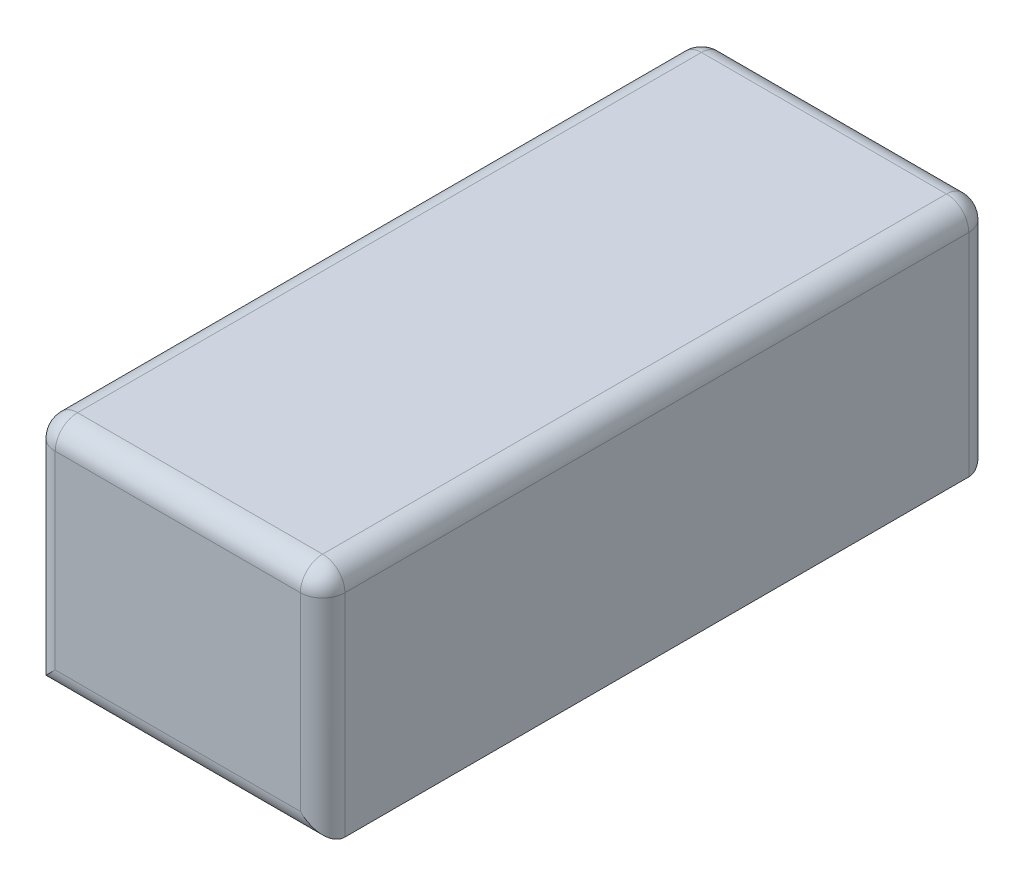
ISO-10303-21;
HEADER;
FILE_DESCRIPTION(('STEP AP214'),'2;1');
FILE_NAME('part.step','',(''),(''),'','','');
FILE_SCHEMA(('AUTOMOTIVE_DESIGN { 1 0 10303 214 1 1 1 1 }'));
ENDSEC;
DATA;
#1=APPLICATION_CONTEXT('core data for automotive mechanical design processes');
#2=APPLICATION_PROTOCOL_DEFINITION('international standard','automotive_design',2000,#1);
#3=PRODUCT_CONTEXT('',#1,'mechanical');
#4=PRODUCT('Part','Part','',(#3));
#5=PRODUCT_RELATED_PRODUCT_CATEGORY('part','',(#4));
#6=PRODUCT_DEFINITION_FORMATION('','',#4);
#7=PRODUCT_DEFINITION_CONTEXT('part definition',#1,'design');
#8=PRODUCT_DEFINITION('design','',#6,#7);
#9=PRODUCT_DEFINITION_SHAPE('','',#8);
#10=(LENGTH_UNIT() NAMED_UNIT(*) SI_UNIT(.MILLI.,.METRE.));
#11=(NAMED_UNIT(*) PLANE_ANGLE_UNIT() SI_UNIT($,.RADIAN.));
#12=(NAMED_UNIT(*) SI_UNIT($,.STERADIAN.) SOLID_ANGLE_UNIT());
#13=UNCERTAINTY_MEASURE_WITH_UNIT(LENGTH_MEASURE(1.E-05),#10,'distance_accuracy_value','');
#14=(GEOMETRIC_REPRESENTATION_CONTEXT(3) GLOBAL_UNCERTAINTY_ASSIGNED_CONTEXT((#13)) GLOBAL_UNIT_ASSIGNED_CONTEXT((#10,
#11,#12)) REPRESENTATION_CONTEXT('',''));
#15=CARTESIAN_POINT('',(0.,0.,0.));
#16=DIRECTION('',(0.,0.,1.));
#17=DIRECTION('',(1.,0.,0.));
#18=AXIS2_PLACEMENT_3D('',#15,#16,#17);
#19=CARTESIAN_POINT('',(13.,10.5,60.));
#20=DIRECTION('',(-1.,0.,0.));
#21=DIRECTION('',(0.,-1.,0.));
#22=AXIS2_PLACEMENT_3D('',#19,#20,#21);
#23=PLANE('',#22);
#24=DIRECTION('',(0.,0.,-1.));
#25=VECTOR('',#24,1.);
#26=CARTESIAN_POINT('',(13.,-10.5,60.));
#27=LINE('',#26,#25);
#28=CARTESIAN_POINT('',(13.,-10.5,58.));
#29=VERTEX_POINT('',#28);
#30=CARTESIAN_POINT('',(13.,-10.5,2.));
#31=VERTEX_POINT('',#30);
#32=EDGE_CURVE('E123',#29,#31,#27,.T.);
#33=ORIENTED_EDGE('',*,*,#32,.T.);
#34=DIRECTION('',(0.,1.,0.));
#35=VECTOR('',#34,1.);
#36=CARTESIAN_POINT('',(13.,10.5,2.));
#37=LINE('',#36,#35);
#38=CARTESIAN_POINT('',(13.,8.5,2.));
#39=VERTEX_POINT('',#38);
#40=EDGE_CURVE('E172',#31,#39,#37,.T.);
#41=ORIENTED_EDGE('',*,*,#40,.T.);
#42=DIRECTION('',(0.,0.,-1.));
#43=VECTOR('',#42,1.);
#44=CARTESIAN_POINT('',(13.,8.5,60.));
#45=LINE('',#44,#43);
#46=CARTESIAN_POINT('',(13.,8.5,58.));
#47=VERTEX_POINT('',#46);
#48=EDGE_CURVE('E168',#39,#47,#45,.F.);
#49=ORIENTED_EDGE('',*,*,#48,.T.);
#50=DIRECTION('',(0.,1.,0.));
#51=VECTOR('',#50,1.);
#52=CARTESIAN_POINT('',(13.,-10.5,58.));
#53=LINE('',#52,#51);
#54=EDGE_CURVE('E170',#47,#29,#53,.F.);
#55=ORIENTED_EDGE('',*,*,#54,.T.);
#56=EDGE_LOOP('',(#33,#41,#49,#55));
#57=FACE_BOUND('',#56,.T.);
#58=ADVANCED_FACE('F41',(#57),#23,.F.);
#59=CARTESIAN_POINT('',(-13.,10.5,60.));
#60=DIRECTION('',(0.,-1.,0.));
#61=DIRECTION('',(0.,0.,-1.));
#62=AXIS2_PLACEMENT_3D('',#59,#60,#61);
#63=PLANE('',#62);
#64=DIRECTION('',(-1.,0.,0.));
#65=VECTOR('',#64,1.);
#66=CARTESIAN_POINT('',(13.,10.5,58.));
#67=LINE('',#66,#65);
#68=CARTESIAN_POINT('',(-11.,10.5,58.));
#69=VERTEX_POINT('',#68);
#70=CARTESIAN_POINT('',(11.,10.5,58.));
#71=VERTEX_POINT('',#70);
#72=EDGE_CURVE('E50',#69,#71,#67,.F.);
#73=ORIENTED_EDGE('',*,*,#72,.T.);
#74=DIRECTION('',(0.,0.,-1.));
#75=VECTOR('',#74,1.);
#76=CARTESIAN_POINT('',(11.,10.5,60.));
#77=LINE('',#76,#75);
#78=CARTESIAN_POINT('',(11.,10.5,2.));
#79=VERTEX_POINT('',#78);
#80=EDGE_CURVE('E11',#71,#79,#77,.T.);
#81=ORIENTED_EDGE('',*,*,#80,.T.);
#82=DIRECTION('',(-1.,0.,0.));
#83=VECTOR('',#82,1.);
#84=CARTESIAN_POINT('',(-13.,10.5,2.));
#85=LINE('',#84,#83);
#86=CARTESIAN_POINT('',(-11.,10.5,2.));
#87=VERTEX_POINT('',#86);
#88=EDGE_CURVE('E181',#79,#87,#85,.T.);
#89=ORIENTED_EDGE('',*,*,#88,.T.);
#90=DIRECTION('',(0.,0.,-1.));
#91=VECTOR('',#90,1.);
#92=CARTESIAN_POINT('',(-11.,10.5,60.));
#93=LINE('',#92,#91);
#94=EDGE_CURVE('E61',#87,#69,#93,.F.);
#95=ORIENTED_EDGE('',*,*,#94,.T.);
#96=EDGE_LOOP('',(#73,#81,#89,#95));
#97=FACE_BOUND('',#96,.T.);
#98=ADVANCED_FACE('F258',(#97),#63,.F.);
#99=CARTESIAN_POINT('',(-13.,10.5,60.));
#100=DIRECTION('',(1.,0.,0.));
#101=DIRECTION('',(0.,1.,0.));
#102=AXIS2_PLACEMENT_3D('',#99,#100,#101);
#103=PLANE('',#102);
#104=DIRECTION('',(0.,0.,-1.));
#105=VECTOR('',#104,1.);
#106=CARTESIAN_POINT('',(-13.,8.5,60.));
#107=LINE('',#106,#105);
#108=CARTESIAN_POINT('',(-13.,8.5,58.));
#109=VERTEX_POINT('',#108);
#110=CARTESIAN_POINT('',(-13.,8.5,2.));
#111=VERTEX_POINT('',#110);
#112=EDGE_CURVE('E138',#109,#111,#107,.T.);
#113=ORIENTED_EDGE('',*,*,#112,.T.);
#114=DIRECTION('',(0.,-1.,0.));
#115=VECTOR('',#114,1.);
#116=CARTESIAN_POINT('',(-13.,10.5,2.));
#117=LINE('',#116,#115);
#118=CARTESIAN_POINT('',(-13.,-10.5,2.));
#119=VERTEX_POINT('',#118);
#120=EDGE_CURVE('E137',#111,#119,#117,.T.);
#121=ORIENTED_EDGE('',*,*,#120,.T.);
#122=DIRECTION('',(0.,0.,-1.));
#123=VECTOR('',#122,1.);
#124=CARTESIAN_POINT('',(-13.,-10.5,60.));
#125=LINE('',#124,#123);
#126=CARTESIAN_POINT('',(-13.,-10.5,58.));
#127=VERTEX_POINT('',#126);
#128=EDGE_CURVE('E121',#127,#119,#125,.T.);
#129=ORIENTED_EDGE('',*,*,#128,.F.);
#130=DIRECTION('',(0.,-1.,0.));
#131=VECTOR('',#130,1.);
#132=CARTESIAN_POINT('',(-13.,10.5,58.));
#133=LINE('',#132,#131);
#134=EDGE_CURVE('E134',#127,#109,#133,.F.);
#135=ORIENTED_EDGE('',*,*,#134,.T.);
#136=EDGE_LOOP('',(#113,#121,#129,#135));
#137=FACE_BOUND('',#136,.T.);
#138=ADVANCED_FACE('F132',(#137),#103,.F.);
#139=CARTESIAN_POINT('',(-13.,-10.5,60.));
#140=DIRECTION('',(0.,1.,0.));
#141=DIRECTION('',(0.,0.,1.));
#142=AXIS2_PLACEMENT_3D('',#139,#140,#141);
#143=PLANE('',#142);
#144=ORIENTED_EDGE('',*,*,#128,.T.);
#145=DIRECTION('',(1.,0.,0.));
#146=VECTOR('',#145,1.);
#147=CARTESIAN_POINT('',(-13.,-10.5,2.));
#148=LINE('',#147,#146);
#149=EDGE_CURVE('E127',#119,#31,#148,.T.);
#150=ORIENTED_EDGE('',*,*,#149,.T.);
#151=ORIENTED_EDGE('',*,*,#32,.F.);
#152=DIRECTION('',(1.,0.,0.));
#153=VECTOR('',#152,1.);
#154=CARTESIAN_POINT('',(-13.,-10.5,58.));
#155=LINE('',#154,#153);
#156=EDGE_CURVE('E118',#29,#127,#155,.F.);
#157=ORIENTED_EDGE('',*,*,#156,.T.);
#158=EDGE_LOOP('',(#144,#150,#151,#157));
#159=FACE_BOUND('',#158,.T.);
#160=ADVANCED_FACE('F120',(#159),#143,.F.);
#161=CARTESIAN_POINT('',(0.,0.,60.));
#162=DIRECTION('',(0.,0.,1.));
#163=DIRECTION('',(1.,0.,0.));
#164=AXIS2_PLACEMENT_3D('',#161,#162,#163);
#165=PLANE('',#164);
#166=DIRECTION('',(0.,-1.,0.));
#167=VECTOR('',#166,1.);
#168=CARTESIAN_POINT('',(-11.,-10.5,60.));
#169=LINE('',#168,#167);
#170=CARTESIAN_POINT('',(-11.,8.5,60.));
#171=VERTEX_POINT('',#170);
#172=CARTESIAN_POINT('',(-11.,-8.5,60.));
#173=VERTEX_POINT('',#172);
#174=EDGE_CURVE('E178',#171,#173,#169,.T.);
#175=ORIENTED_EDGE('',*,*,#174,.T.);
#176=DIRECTION('',(1.,0.,0.));
#177=VECTOR('',#176,1.);
#178=CARTESIAN_POINT('',(13.,-8.5,60.));
#179=LINE('',#178,#177);
#180=CARTESIAN_POINT('',(11.,-8.5,60.));
#181=VERTEX_POINT('',#180);
#182=EDGE_CURVE('E145',#173,#181,#179,.T.);
#183=ORIENTED_EDGE('',*,*,#182,.T.);
#184=DIRECTION('',(0.,1.,0.));
#185=VECTOR('',#184,1.);
#186=CARTESIAN_POINT('',(11.,10.5,60.));
#187=LINE('',#186,#185);
#188=CARTESIAN_POINT('',(11.,8.5,60.));
#189=VERTEX_POINT('',#188);
#190=EDGE_CURVE('E176',#181,#189,#187,.T.);
#191=ORIENTED_EDGE('',*,*,#190,.T.);
#192=DIRECTION('',(-1.,0.,0.));
#193=VECTOR('',#192,1.);
#194=CARTESIAN_POINT('',(-13.,8.5,60.));
#195=LINE('',#194,#193);
#196=EDGE_CURVE('E174',#189,#171,#195,.T.);
#197=ORIENTED_EDGE('',*,*,#196,.T.);
#198=EDGE_LOOP('',(#175,#183,#191,#197));
#199=FACE_BOUND('',#198,.T.);
#200=ADVANCED_FACE('F390',(#199),#165,.T.);
#201=CARTESIAN_POINT('',(0.,0.,0.));
#202=DIRECTION('',(0.,0.,1.));
#203=DIRECTION('',(1.,0.,0.));
#204=AXIS2_PLACEMENT_3D('',#201,#202,#203);
#205=PLANE('',#204);
#206=DIRECTION('',(1.,0.,0.));
#207=VECTOR('',#206,1.);
#208=CARTESIAN_POINT('',(0.,-8.5,0.));
#209=LINE('',#208,#207);
#210=CARTESIAN_POINT('',(11.,-8.5,0.));
#211=VERTEX_POINT('',#210);
#212=CARTESIAN_POINT('',(-11.,-8.5,0.));
#213=VERTEX_POINT('',#212);
#214=EDGE_CURVE('E163',#211,#213,#209,.F.);
#215=ORIENTED_EDGE('',*,*,#214,.T.);
#216=DIRECTION('',(0.,-1.,0.));
#217=VECTOR('',#216,1.);
#218=CARTESIAN_POINT('',(-11.,0.,0.));
#219=LINE('',#218,#217);
#220=CARTESIAN_POINT('',(-11.,8.5,0.));
#221=VERTEX_POINT('',#220);
#222=EDGE_CURVE('E128',#213,#221,#219,.F.);
#223=ORIENTED_EDGE('',*,*,#222,.T.);
#224=DIRECTION('',(-1.,0.,0.));
#225=VECTOR('',#224,1.);
#226=CARTESIAN_POINT('',(0.,8.5,0.));
#227=LINE('',#226,#225);
#228=CARTESIAN_POINT('',(11.,8.5,0.));
#229=VERTEX_POINT('',#228);
#230=EDGE_CURVE('E156',#221,#229,#227,.F.);
#231=ORIENTED_EDGE('',*,*,#230,.T.);
#232=DIRECTION('',(0.,1.,0.));
#233=VECTOR('',#232,1.);
#234=CARTESIAN_POINT('',(11.,0.,0.));
#235=LINE('',#234,#233);
#236=EDGE_CURVE('E161',#229,#211,#235,.F.);
#237=ORIENTED_EDGE('',*,*,#236,.T.);
#238=EDGE_LOOP('',(#215,#223,#231,#237));
#239=FACE_BOUND('',#238,.T.);
#240=ADVANCED_FACE('F240',(#239),#205,.F.);
#241=CARTESIAN_POINT('',(11.,0.,58.));
#242=DIRECTION('',(0.,-1.,0.));
#243=DIRECTION('',(1.,0.,0.));
#244=AXIS2_PLACEMENT_3D('',#241,#242,#243);
#245=CYLINDRICAL_SURFACE('',#244,2.);
#246=CARTESIAN_POINT('',(11.,8.5,58.));
#247=DIRECTION('',(0.,1.,0.));
#248=DIRECTION('',(0.,0.,1.));
#249=AXIS2_PLACEMENT_3D('',#246,#247,#248);
#250=CIRCLE('',#249,2.);
#251=EDGE_CURVE('E216',#189,#47,#250,.T.);
#252=ORIENTED_EDGE('',*,*,#251,.F.);
#253=ORIENTED_EDGE('',*,*,#190,.F.);
#254=CARTESIAN_POINT('',(11.,-8.5,58.));
#255=DIRECTION('',(-0.707106781186547,-0.707106781186548,0.));
#256=DIRECTION('',(0.707106781186548,-0.707106781186547,0.));
#257=AXIS2_PLACEMENT_3D('',#254,#255,#256);
#258=ELLIPSE('',#257,2.82842712474619,2.);
#259=EDGE_CURVE('E45',#29,#181,#258,.T.);
#260=ORIENTED_EDGE('',*,*,#259,.F.);
#261=ORIENTED_EDGE('',*,*,#54,.F.);
#262=EDGE_LOOP('',(#252,#253,#260,#261));
#263=FACE_BOUND('',#262,.T.);
#264=ADVANCED_FACE('F43',(#263),#245,.T.);
#265=CARTESIAN_POINT('',(0.,-8.5,58.));
#266=DIRECTION('',(-1.,0.,0.));
#267=DIRECTION('',(0.,0.,1.));
#268=AXIS2_PLACEMENT_3D('',#265,#266,#267);
#269=CYLINDRICAL_SURFACE('',#268,2.);
#270=ORIENTED_EDGE('',*,*,#259,.T.);
#271=ORIENTED_EDGE('',*,*,#182,.F.);
#272=CARTESIAN_POINT('',(-11.,-8.5,58.));
#273=DIRECTION('',(-0.707106781186548,0.707106781186547,0.));
#274=DIRECTION('',(0.707106781186547,0.707106781186548,0.));
#275=AXIS2_PLACEMENT_3D('',#272,#273,#274);
#276=ELLIPSE('',#275,2.82842712474619,2.);
#277=EDGE_CURVE('E142',#127,#173,#276,.T.);
#278=ORIENTED_EDGE('',*,*,#277,.F.);
#279=ORIENTED_EDGE('',*,*,#156,.F.);
#280=EDGE_LOOP('',(#270,#271,#278,#279));
#281=FACE_BOUND('',#280,.T.);
#282=ADVANCED_FACE('F143',(#281),#269,.T.);
#283=CARTESIAN_POINT('',(11.,8.5,58.));
#284=DIRECTION('',(0.,0.,1.));
#285=DIRECTION('',(1.,0.,0.));
#286=AXIS2_PLACEMENT_3D('',#283,#284,#285);
#287=SPHERICAL_SURFACE('',#286,2.);
#288=CARTESIAN_POINT('',(11.,8.5,58.));
#289=DIRECTION('',(0.,0.,1.));
#290=DIRECTION('',(1.,0.,0.));
#291=AXIS2_PLACEMENT_3D('',#288,#289,#290);
#292=CIRCLE('',#291,2.);
#293=EDGE_CURVE('E149',#71,#47,#292,.F.);
#294=ORIENTED_EDGE('',*,*,#293,.F.);
#295=CARTESIAN_POINT('',(11.,8.5,58.));
#296=DIRECTION('',(1.,0.,0.));
#297=DIRECTION('',(0.,0.,-1.));
#298=AXIS2_PLACEMENT_3D('',#295,#296,#297);
#299=CIRCLE('',#298,2.);
#300=EDGE_CURVE('E148',#189,#71,#299,.F.);
#301=ORIENTED_EDGE('',*,*,#300,.F.);
#302=ORIENTED_EDGE('',*,*,#251,.T.);
#303=EDGE_LOOP('',(#294,#301,#302));
#304=FACE_BOUND('',#303,.T.);
#305=ADVANCED_FACE('F268',(#304),#287,.T.);
#306=CARTESIAN_POINT('',(0.,8.5,58.));
#307=DIRECTION('',(1.,0.,0.));
#308=DIRECTION('',(0.,0.,-1.));
#309=AXIS2_PLACEMENT_3D('',#306,#307,#308);
#310=CYLINDRICAL_SURFACE('',#309,2.);
#311=ORIENTED_EDGE('',*,*,#300,.T.);
#312=ORIENTED_EDGE('',*,*,#72,.F.);
#313=CARTESIAN_POINT('',(-11.,8.5,58.));
#314=DIRECTION('',(-1.,0.,0.));
#315=DIRECTION('',(0.,0.,1.));
#316=AXIS2_PLACEMENT_3D('',#313,#314,#315);
#317=CIRCLE('',#316,2.);
#318=EDGE_CURVE('E211',#171,#69,#317,.T.);
#319=ORIENTED_EDGE('',*,*,#318,.F.);
#320=ORIENTED_EDGE('',*,*,#196,.F.);
#321=EDGE_LOOP('',(#311,#312,#319,#320));
#322=FACE_BOUND('',#321,.T.);
#323=ADVANCED_FACE('F267',(#322),#310,.T.);
#324=CARTESIAN_POINT('',(-11.,0.,58.));
#325=DIRECTION('',(0.,1.,0.));
#326=DIRECTION('',(-1.,0.,0.));
#327=AXIS2_PLACEMENT_3D('',#324,#325,#326);
#328=CYLINDRICAL_SURFACE('',#327,2.);
#329=ORIENTED_EDGE('',*,*,#277,.T.);
#330=ORIENTED_EDGE('',*,*,#174,.F.);
#331=CARTESIAN_POINT('',(-11.,8.5,58.));
#332=DIRECTION('',(0.,1.,0.));
#333=DIRECTION('',(0.,0.,1.));
#334=AXIS2_PLACEMENT_3D('',#331,#332,#333);
#335=CIRCLE('',#334,2.);
#336=EDGE_CURVE('E153',#109,#171,#335,.T.);
#337=ORIENTED_EDGE('',*,*,#336,.F.);
#338=ORIENTED_EDGE('',*,*,#134,.F.);
#339=EDGE_LOOP('',(#329,#330,#337,#338));
#340=FACE_BOUND('',#339,.T.);
#341=ADVANCED_FACE('F151',(#340),#328,.T.);
#342=CARTESIAN_POINT('',(11.,8.5,60.));
#343=DIRECTION('',(0.,0.,-1.));
#344=DIRECTION('',(-1.,0.,0.));
#345=AXIS2_PLACEMENT_3D('',#342,#343,#344);
#346=CYLINDRICAL_SURFACE('',#345,2.);
#347=ORIENTED_EDGE('',*,*,#293,.T.);
#348=ORIENTED_EDGE('',*,*,#48,.F.);
#349=CARTESIAN_POINT('',(11.,8.5,2.));
#350=DIRECTION('',(0.,0.,-1.));
#351=DIRECTION('',(-1.,0.,0.));
#352=AXIS2_PLACEMENT_3D('',#349,#350,#351);
#353=CIRCLE('',#352,2.);
#354=EDGE_CURVE('E207',#79,#39,#353,.T.);
#355=ORIENTED_EDGE('',*,*,#354,.F.);
#356=ORIENTED_EDGE('',*,*,#80,.F.);
#357=EDGE_LOOP('',(#347,#348,#355,#356));
#358=FACE_BOUND('',#357,.T.);
#359=ADVANCED_FACE('F257',(#358),#346,.T.);
#360=CARTESIAN_POINT('',(-11.,8.5,58.));
#361=DIRECTION('',(0.,0.,1.));
#362=DIRECTION('',(1.,0.,0.));
#363=AXIS2_PLACEMENT_3D('',#360,#361,#362);
#364=SPHERICAL_SURFACE('',#363,2.);
#365=ORIENTED_EDGE('',*,*,#336,.T.);
#366=ORIENTED_EDGE('',*,*,#318,.T.);
#367=CARTESIAN_POINT('',(-11.,8.5,58.));
#368=DIRECTION('',(0.,0.,1.));
#369=DIRECTION('',(1.,0.,0.));
#370=AXIS2_PLACEMENT_3D('',#367,#368,#369);
#371=CIRCLE('',#370,2.);
#372=EDGE_CURVE('E201',#109,#69,#371,.F.);
#373=ORIENTED_EDGE('',*,*,#372,.F.);
#374=EDGE_LOOP('',(#365,#366,#373));
#375=FACE_BOUND('',#374,.T.);
#376=ADVANCED_FACE('F263',(#375),#364,.T.);
#377=CARTESIAN_POINT('',(11.,8.5,2.));
#378=DIRECTION('',(0.,1.,0.));
#379=DIRECTION('',(0.,0.,1.));
#380=AXIS2_PLACEMENT_3D('',#377,#378,#379);
#381=SPHERICAL_SURFACE('',#380,2.);
#382=CARTESIAN_POINT('',(11.,8.5,2.));
#383=DIRECTION('',(0.,1.,0.));
#384=DIRECTION('',(0.,0.,1.));
#385=AXIS2_PLACEMENT_3D('',#382,#383,#384);
#386=CIRCLE('',#385,2.);
#387=EDGE_CURVE('E198',#229,#39,#386,.F.);
#388=ORIENTED_EDGE('',*,*,#387,.F.);
#389=CARTESIAN_POINT('',(11.,8.5,2.));
#390=DIRECTION('',(1.,0.,0.));
#391=DIRECTION('',(0.,1.,0.));
#392=AXIS2_PLACEMENT_3D('',#389,#390,#391);
#393=CIRCLE('',#392,2.);
#394=EDGE_CURVE('E204',#79,#229,#393,.F.);
#395=ORIENTED_EDGE('',*,*,#394,.F.);
#396=ORIENTED_EDGE('',*,*,#354,.T.);
#397=EDGE_LOOP('',(#388,#395,#396));
#398=FACE_BOUND('',#397,.T.);
#399=ADVANCED_FACE('F254',(#398),#381,.T.);
#400=CARTESIAN_POINT('',(-13.,8.5,2.));
#401=DIRECTION('',(-1.,0.,0.));
#402=DIRECTION('',(0.,0.,1.));
#403=AXIS2_PLACEMENT_3D('',#400,#401,#402);
#404=CYLINDRICAL_SURFACE('',#403,2.);
#405=ORIENTED_EDGE('',*,*,#394,.T.);
#406=ORIENTED_EDGE('',*,*,#230,.F.);
#407=CARTESIAN_POINT('',(-11.,8.5,2.));
#408=DIRECTION('',(-1.,0.,0.));
#409=DIRECTION('',(0.,0.,1.));
#410=AXIS2_PLACEMENT_3D('',#407,#408,#409);
#411=CIRCLE('',#410,2.);
#412=EDGE_CURVE('E195',#87,#221,#411,.T.);
#413=ORIENTED_EDGE('',*,*,#412,.F.);
#414=ORIENTED_EDGE('',*,*,#88,.F.);
#415=EDGE_LOOP('',(#405,#406,#413,#414));
#416=FACE_BOUND('',#415,.T.);
#417=ADVANCED_FACE('F250',(#416),#404,.T.);
#418=CARTESIAN_POINT('',(-11.,8.5,60.));
#419=DIRECTION('',(0.,0.,-1.));
#420=DIRECTION('',(-1.,0.,0.));
#421=AXIS2_PLACEMENT_3D('',#418,#419,#420);
#422=CYLINDRICAL_SURFACE('',#421,2.);
#423=ORIENTED_EDGE('',*,*,#372,.T.);
#424=ORIENTED_EDGE('',*,*,#94,.F.);
#425=CARTESIAN_POINT('',(-11.,8.5,2.));
#426=DIRECTION('',(0.,0.,-1.));
#427=DIRECTION('',(-1.,0.,0.));
#428=AXIS2_PLACEMENT_3D('',#425,#426,#427);
#429=CIRCLE('',#428,2.);
#430=EDGE_CURVE('E192',#111,#87,#429,.T.);
#431=ORIENTED_EDGE('',*,*,#430,.F.);
#432=ORIENTED_EDGE('',*,*,#112,.F.);
#433=EDGE_LOOP('',(#423,#424,#431,#432));
#434=FACE_BOUND('',#433,.T.);
#435=ADVANCED_FACE('F260',(#434),#422,.T.);
#436=CARTESIAN_POINT('',(11.,10.5,2.));
#437=DIRECTION('',(0.,1.,0.));
#438=DIRECTION('',(-1.,0.,0.));
#439=AXIS2_PLACEMENT_3D('',#436,#437,#438);
#440=CYLINDRICAL_SURFACE('',#439,2.);
#441=ORIENTED_EDGE('',*,*,#387,.T.);
#442=ORIENTED_EDGE('',*,*,#40,.F.);
#443=CARTESIAN_POINT('',(11.,-8.5,2.));
#444=DIRECTION('',(0.707106781186547,0.707106781186548,0.));
#445=DIRECTION('',(-0.707106781186548,0.707106781186547,0.));
#446=AXIS2_PLACEMENT_3D('',#443,#444,#445);
#447=ELLIPSE('',#446,2.82842712474619,2.);
#448=EDGE_CURVE('E189',#211,#31,#447,.F.);
#449=ORIENTED_EDGE('',*,*,#448,.F.);
#450=ORIENTED_EDGE('',*,*,#236,.F.);
#451=EDGE_LOOP('',(#441,#442,#449,#450));
#452=FACE_BOUND('',#451,.T.);
#453=ADVANCED_FACE('F230',(#452),#440,.T.);
#454=CARTESIAN_POINT('',(-11.,8.5,2.));
#455=DIRECTION('',(0.,1.,0.));
#456=DIRECTION('',(0.,0.,1.));
#457=AXIS2_PLACEMENT_3D('',#454,#455,#456);
#458=SPHERICAL_SURFACE('',#457,2.);
#459=ORIENTED_EDGE('',*,*,#430,.T.);
#460=ORIENTED_EDGE('',*,*,#412,.T.);
#461=CARTESIAN_POINT('',(-11.,8.5,2.));
#462=DIRECTION('',(0.,1.,0.));
#463=DIRECTION('',(0.,0.,1.));
#464=AXIS2_PLACEMENT_3D('',#461,#462,#463);
#465=CIRCLE('',#464,2.);
#466=EDGE_CURVE('E187',#111,#221,#465,.F.);
#467=ORIENTED_EDGE('',*,*,#466,.F.);
#468=EDGE_LOOP('',(#459,#460,#467));
#469=FACE_BOUND('',#468,.T.);
#470=ADVANCED_FACE('F247',(#469),#458,.T.);
#471=CARTESIAN_POINT('',(-13.,-8.5,2.));
#472=DIRECTION('',(1.,0.,0.));
#473=DIRECTION('',(0.,0.,-1.));
#474=AXIS2_PLACEMENT_3D('',#471,#472,#473);
#475=CYLINDRICAL_SURFACE('',#474,2.);
#476=ORIENTED_EDGE('',*,*,#448,.T.);
#477=ORIENTED_EDGE('',*,*,#149,.F.);
#478=CARTESIAN_POINT('',(-11.,-8.5,2.));
#479=DIRECTION('',(0.707106781186548,-0.707106781186547,0.));
#480=DIRECTION('',(0.707106781186547,0.707106781186548,0.));
#481=AXIS2_PLACEMENT_3D('',#478,#479,#480);
#482=ELLIPSE('',#481,2.82842712474619,2.);
#483=EDGE_CURVE('E185',#213,#119,#482,.F.);
#484=ORIENTED_EDGE('',*,*,#483,.F.);
#485=ORIENTED_EDGE('',*,*,#214,.F.);
#486=EDGE_LOOP('',(#476,#477,#484,#485));
#487=FACE_BOUND('',#486,.T.);
#488=ADVANCED_FACE('F236',(#487),#475,.T.);
#489=CARTESIAN_POINT('',(-11.,10.5,2.));
#490=DIRECTION('',(0.,-1.,0.));
#491=DIRECTION('',(1.,0.,0.));
#492=AXIS2_PLACEMENT_3D('',#489,#490,#491);
#493=CYLINDRICAL_SURFACE('',#492,2.);
#494=ORIENTED_EDGE('',*,*,#466,.T.);
#495=ORIENTED_EDGE('',*,*,#222,.F.);
#496=ORIENTED_EDGE('',*,*,#483,.T.);
#497=ORIENTED_EDGE('',*,*,#120,.F.);
#498=EDGE_LOOP('',(#494,#495,#496,#497));
#499=FACE_BOUND('',#498,.T.);
#500=ADVANCED_FACE('F242',(#499),#493,.T.);
#501=CLOSED_SHELL('',(#58,#98,#138,#160,#200,#240,#264,#282,#305,#323,#341,#359,#376,#399,#417,
#435,#453,#470,#488,#500));
#502=MANIFOLD_SOLID_BREP('B2',#501);
#503=ADVANCED_BREP_SHAPE_REPRESENTATION('',(#18,#502),#14);
#504=SHAPE_DEFINITION_REPRESENTATION(#9,#503);
ENDSEC;
END-ISO-10303-21;
